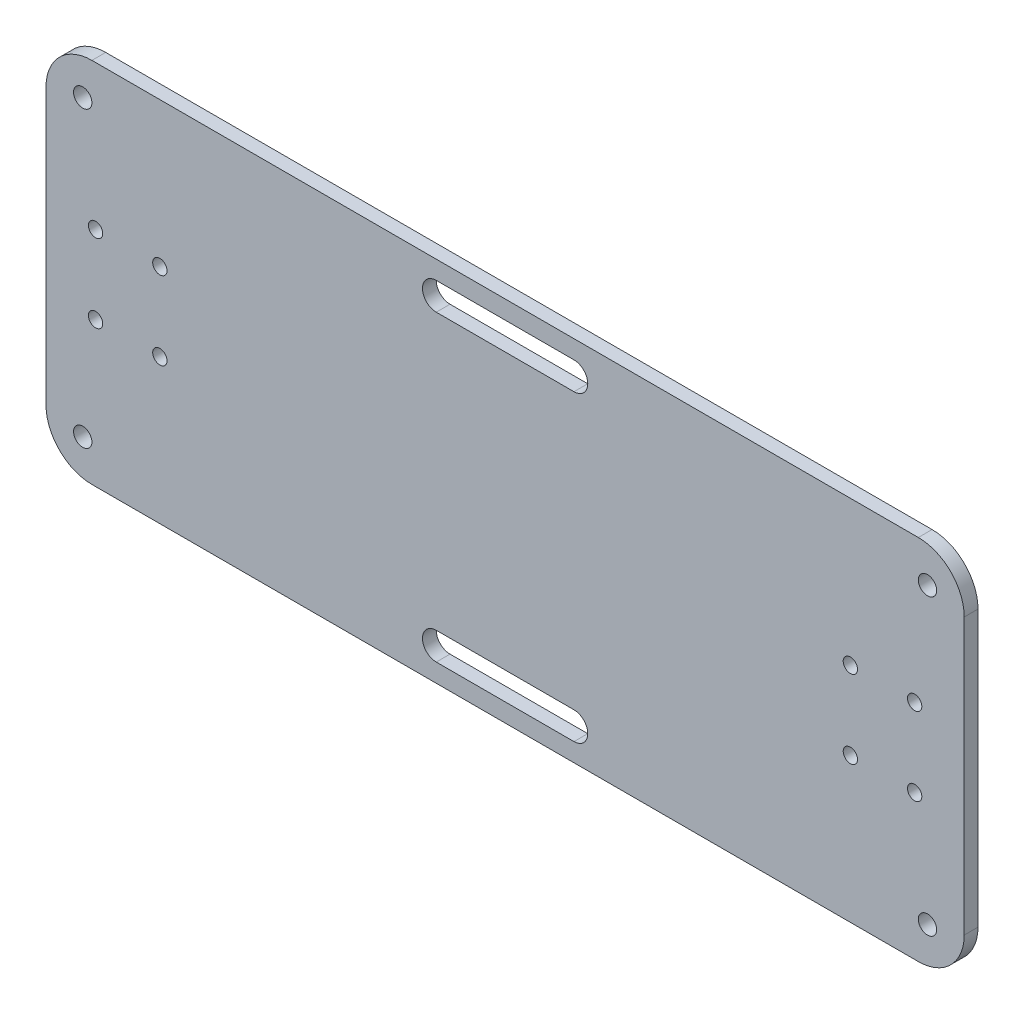
ISO-10303-21;
HEADER;
FILE_DESCRIPTION(('STEP AP214'),'2;1');
FILE_NAME('part.step','',(''),(''),'','','');
FILE_SCHEMA(('AUTOMOTIVE_DESIGN { 1 0 10303 214 1 1 1 1 }'));
ENDSEC;
DATA;
#1=APPLICATION_CONTEXT('core data for automotive mechanical design processes');
#2=APPLICATION_PROTOCOL_DEFINITION('international standard','automotive_design',2000,#1);
#3=PRODUCT_CONTEXT('',#1,'mechanical');
#4=PRODUCT('Part','Part','',(#3));
#5=PRODUCT_RELATED_PRODUCT_CATEGORY('part','',(#4));
#6=PRODUCT_DEFINITION_FORMATION('','',#4);
#7=PRODUCT_DEFINITION_CONTEXT('part definition',#1,'design');
#8=PRODUCT_DEFINITION('design','',#6,#7);
#9=PRODUCT_DEFINITION_SHAPE('','',#8);
#10=(LENGTH_UNIT() NAMED_UNIT(*) SI_UNIT(.MILLI.,.METRE.));
#11=(NAMED_UNIT(*) PLANE_ANGLE_UNIT() SI_UNIT($,.RADIAN.));
#12=(NAMED_UNIT(*) SI_UNIT($,.STERADIAN.) SOLID_ANGLE_UNIT());
#13=UNCERTAINTY_MEASURE_WITH_UNIT(LENGTH_MEASURE(1.E-05),#10,'distance_accuracy_value','');
#14=(GEOMETRIC_REPRESENTATION_CONTEXT(3) GLOBAL_UNCERTAINTY_ASSIGNED_CONTEXT((#13)) GLOBAL_UNIT_ASSIGNED_CONTEXT((#10,
#11,#12)) REPRESENTATION_CONTEXT('',''));
#15=CARTESIAN_POINT('',(0.,0.,0.));
#16=DIRECTION('',(0.,0.,1.));
#17=DIRECTION('',(1.,0.,0.));
#18=AXIS2_PLACEMENT_3D('',#15,#16,#17);
#19=CARTESIAN_POINT('',(100.,40.,3.));
#20=DIRECTION('',(-1.,0.,0.));
#21=DIRECTION('',(0.,0.,1.));
#22=AXIS2_PLACEMENT_3D('',#19,#20,#21);
#23=PLANE('',#22);
#24=DIRECTION('',(0.,1.,0.));
#25=VECTOR('',#24,1.);
#26=CARTESIAN_POINT('',(100.,40.,3.));
#27=LINE('',#26,#25);
#28=CARTESIAN_POINT('',(100.,-30.,3.));
#29=VERTEX_POINT('',#28);
#30=CARTESIAN_POINT('',(100.,30.,3.));
#31=VERTEX_POINT('',#30);
#32=EDGE_CURVE('E288',#29,#31,#27,.T.);
#33=ORIENTED_EDGE('',*,*,#32,.F.);
#34=DIRECTION('',(0.,0.,-1.));
#35=VECTOR('',#34,1.);
#36=CARTESIAN_POINT('',(100.,-30.,3.));
#37=LINE('',#36,#35);
#38=CARTESIAN_POINT('',(100.,-30.,0.));
#39=VERTEX_POINT('',#38);
#40=EDGE_CURVE('E339',#29,#39,#37,.T.);
#41=ORIENTED_EDGE('',*,*,#40,.T.);
#42=DIRECTION('',(0.,1.,0.));
#43=VECTOR('',#42,1.);
#44=CARTESIAN_POINT('',(100.,40.,0.));
#45=LINE('',#44,#43);
#46=CARTESIAN_POINT('',(100.,30.,0.));
#47=VERTEX_POINT('',#46);
#48=EDGE_CURVE('E285',#39,#47,#45,.T.);
#49=ORIENTED_EDGE('',*,*,#48,.T.);
#50=DIRECTION('',(0.,0.,-1.));
#51=VECTOR('',#50,1.);
#52=CARTESIAN_POINT('',(100.,30.,3.));
#53=LINE('',#52,#51);
#54=EDGE_CURVE('E337',#47,#31,#53,.F.);
#55=ORIENTED_EDGE('',*,*,#54,.T.);
#56=EDGE_LOOP('',(#33,#41,#49,#55));
#57=FACE_BOUND('',#56,.T.);
#58=ADVANCED_FACE('F33',(#57),#23,.F.);
#59=CARTESIAN_POINT('',(-100.,40.,3.));
#60=DIRECTION('',(0.,-1.,0.));
#61=DIRECTION('',(0.,0.,-1.));
#62=AXIS2_PLACEMENT_3D('',#59,#60,#61);
#63=PLANE('',#62);
#64=DIRECTION('',(-1.,0.,0.));
#65=VECTOR('',#64,1.);
#66=CARTESIAN_POINT('',(-100.,40.,3.));
#67=LINE('',#66,#65);
#68=CARTESIAN_POINT('',(90.,40.,3.));
#69=VERTEX_POINT('',#68);
#70=CARTESIAN_POINT('',(-90.,40.,3.));
#71=VERTEX_POINT('',#70);
#72=EDGE_CURVE('E291',#69,#71,#67,.T.);
#73=ORIENTED_EDGE('',*,*,#72,.F.);
#74=DIRECTION('',(0.,0.,-1.));
#75=VECTOR('',#74,1.);
#76=CARTESIAN_POINT('',(90.,40.,3.));
#77=LINE('',#76,#75);
#78=CARTESIAN_POINT('',(90.,40.,0.));
#79=VERTEX_POINT('',#78);
#80=EDGE_CURVE('E11',#69,#79,#77,.T.);
#81=ORIENTED_EDGE('',*,*,#80,.T.);
#82=DIRECTION('',(-1.,0.,0.));
#83=VECTOR('',#82,1.);
#84=CARTESIAN_POINT('',(-100.,40.,0.));
#85=LINE('',#84,#83);
#86=CARTESIAN_POINT('',(-90.,40.,0.));
#87=VERTEX_POINT('',#86);
#88=EDGE_CURVE('E304',#79,#87,#85,.T.);
#89=ORIENTED_EDGE('',*,*,#88,.T.);
#90=DIRECTION('',(0.,0.,-1.));
#91=VECTOR('',#90,1.);
#92=CARTESIAN_POINT('',(-90.,40.,3.));
#93=LINE('',#92,#91);
#94=EDGE_CURVE('E41',#87,#71,#93,.F.);
#95=ORIENTED_EDGE('',*,*,#94,.T.);
#96=EDGE_LOOP('',(#73,#81,#89,#95));
#97=FACE_BOUND('',#96,.T.);
#98=ADVANCED_FACE('F344',(#97),#63,.F.);
#99=CARTESIAN_POINT('',(-100.,40.,3.));
#100=DIRECTION('',(1.,0.,0.));
#101=DIRECTION('',(0.,0.,-1.));
#102=AXIS2_PLACEMENT_3D('',#99,#100,#101);
#103=PLANE('',#102);
#104=DIRECTION('',(0.,-1.,0.));
#105=VECTOR('',#104,1.);
#106=CARTESIAN_POINT('',(-100.,40.,0.));
#107=LINE('',#106,#105);
#108=CARTESIAN_POINT('',(-100.,30.,0.));
#109=VERTEX_POINT('',#108);
#110=CARTESIAN_POINT('',(-100.,-30.,0.));
#111=VERTEX_POINT('',#110);
#112=EDGE_CURVE('E307',#109,#111,#107,.T.);
#113=ORIENTED_EDGE('',*,*,#112,.T.);
#114=DIRECTION('',(0.,0.,-1.));
#115=VECTOR('',#114,1.);
#116=CARTESIAN_POINT('',(-100.,-30.,3.));
#117=LINE('',#116,#115);
#118=CARTESIAN_POINT('',(-100.,-30.,3.));
#119=VERTEX_POINT('',#118);
#120=EDGE_CURVE('E327',#111,#119,#117,.F.);
#121=ORIENTED_EDGE('',*,*,#120,.T.);
#122=DIRECTION('',(0.,-1.,0.));
#123=VECTOR('',#122,1.);
#124=CARTESIAN_POINT('',(-100.,40.,3.));
#125=LINE('',#124,#123);
#126=CARTESIAN_POINT('',(-100.,30.,3.));
#127=VERTEX_POINT('',#126);
#128=EDGE_CURVE('E295',#127,#119,#125,.T.);
#129=ORIENTED_EDGE('',*,*,#128,.F.);
#130=DIRECTION('',(0.,0.,-1.));
#131=VECTOR('',#130,1.);
#132=CARTESIAN_POINT('',(-100.,30.,3.));
#133=LINE('',#132,#131);
#134=EDGE_CURVE('E324',#127,#109,#133,.T.);
#135=ORIENTED_EDGE('',*,*,#134,.T.);
#136=EDGE_LOOP('',(#113,#121,#129,#135));
#137=FACE_BOUND('',#136,.T.);
#138=ADVANCED_FACE('F356',(#137),#103,.F.);
#139=CARTESIAN_POINT('',(-100.,-40.,3.));
#140=DIRECTION('',(0.,1.,0.));
#141=DIRECTION('',(0.,0.,1.));
#142=AXIS2_PLACEMENT_3D('',#139,#140,#141);
#143=PLANE('',#142);
#144=DIRECTION('',(1.,0.,0.));
#145=VECTOR('',#144,1.);
#146=CARTESIAN_POINT('',(-100.,-40.,3.));
#147=LINE('',#146,#145);
#148=CARTESIAN_POINT('',(-90.,-40.,3.));
#149=VERTEX_POINT('',#148);
#150=CARTESIAN_POINT('',(90.,-40.,3.));
#151=VERTEX_POINT('',#150);
#152=EDGE_CURVE('E298',#149,#151,#147,.T.);
#153=ORIENTED_EDGE('',*,*,#152,.F.);
#154=DIRECTION('',(0.,0.,-1.));
#155=VECTOR('',#154,1.);
#156=CARTESIAN_POINT('',(-90.,-40.,3.));
#157=LINE('',#156,#155);
#158=CARTESIAN_POINT('',(-90.,-40.,0.));
#159=VERTEX_POINT('',#158);
#160=EDGE_CURVE('E313',#149,#159,#157,.T.);
#161=ORIENTED_EDGE('',*,*,#160,.T.);
#162=DIRECTION('',(1.,0.,0.));
#163=VECTOR('',#162,1.);
#164=CARTESIAN_POINT('',(-100.,-40.,0.));
#165=LINE('',#164,#163);
#166=CARTESIAN_POINT('',(90.,-40.,0.));
#167=VERTEX_POINT('',#166);
#168=EDGE_CURVE('E292',#159,#167,#165,.T.);
#169=ORIENTED_EDGE('',*,*,#168,.T.);
#170=DIRECTION('',(0.,0.,-1.));
#171=VECTOR('',#170,1.);
#172=CARTESIAN_POINT('',(90.,-40.,3.));
#173=LINE('',#172,#171);
#174=EDGE_CURVE('E301',#167,#151,#173,.F.);
#175=ORIENTED_EDGE('',*,*,#174,.T.);
#176=EDGE_LOOP('',(#153,#161,#169,#175));
#177=FACE_BOUND('',#176,.T.);
#178=ADVANCED_FACE('F366',(#177),#143,.F.);
#179=CARTESIAN_POINT('',(0.,0.,3.));
#180=DIRECTION('',(0.,0.,1.));
#181=DIRECTION('',(1.,0.,0.));
#182=AXIS2_PLACEMENT_3D('',#179,#180,#181);
#183=PLANE('',#182);
#184=CARTESIAN_POINT('',(15.,33.,3.));
#185=DIRECTION('',(0.,0.,1.));
#186=DIRECTION('',(1.,0.,0.));
#187=AXIS2_PLACEMENT_3D('',#184,#185,#186);
#188=CIRCLE('',#187,3.);
#189=CARTESIAN_POINT('',(15.,30.,3.));
#190=VERTEX_POINT('',#189);
#191=CARTESIAN_POINT('',(15.,36.,3.));
#192=VERTEX_POINT('',#191);
#193=EDGE_CURVE('E48',#190,#192,#188,.T.);
#194=ORIENTED_EDGE('',*,*,#193,.F.);
#195=DIRECTION('',(1.,0.,0.));
#196=VECTOR('',#195,1.);
#197=CARTESIAN_POINT('',(15.,30.,3.));
#198=LINE('',#197,#196);
#199=CARTESIAN_POINT('',(-15.,30.,3.));
#200=VERTEX_POINT('',#199);
#201=EDGE_CURVE('E167',#200,#190,#198,.T.);
#202=ORIENTED_EDGE('',*,*,#201,.F.);
#203=CARTESIAN_POINT('',(-15.,33.,3.));
#204=DIRECTION('',(0.,0.,1.));
#205=DIRECTION('',(1.,0.,0.));
#206=AXIS2_PLACEMENT_3D('',#203,#204,#205);
#207=CIRCLE('',#206,3.);
#208=CARTESIAN_POINT('',(-15.,36.,3.));
#209=VERTEX_POINT('',#208);
#210=EDGE_CURVE('E170',#209,#200,#207,.T.);
#211=ORIENTED_EDGE('',*,*,#210,.F.);
#212=DIRECTION('',(-1.,0.,0.));
#213=VECTOR('',#212,1.);
#214=CARTESIAN_POINT('',(15.,36.,3.));
#215=LINE('',#214,#213);
#216=EDGE_CURVE('E176',#192,#209,#215,.T.);
#217=ORIENTED_EDGE('',*,*,#216,.F.);
#218=EDGE_LOOP('',(#194,#202,#211,#217));
#219=FACE_BOUND('',#218,.T.);
#220=CARTESIAN_POINT('',(15.,-33.,3.));
#221=DIRECTION('',(0.,0.,1.));
#222=DIRECTION('',(-1.,0.,0.));
#223=AXIS2_PLACEMENT_3D('',#220,#221,#222);
#224=CIRCLE('',#223,3.);
#225=CARTESIAN_POINT('',(15.,-36.,3.));
#226=VERTEX_POINT('',#225);
#227=CARTESIAN_POINT('',(15.,-30.,3.));
#228=VERTEX_POINT('',#227);
#229=EDGE_CURVE('E56',#226,#228,#224,.T.);
#230=ORIENTED_EDGE('',*,*,#229,.F.);
#231=DIRECTION('',(1.,0.,0.));
#232=VECTOR('',#231,1.);
#233=CARTESIAN_POINT('',(15.,-36.,3.));
#234=LINE('',#233,#232);
#235=CARTESIAN_POINT('',(-15.,-36.,3.));
#236=VERTEX_POINT('',#235);
#237=EDGE_CURVE('E191',#236,#226,#234,.T.);
#238=ORIENTED_EDGE('',*,*,#237,.F.);
#239=CARTESIAN_POINT('',(-15.,-33.,3.));
#240=DIRECTION('',(0.,0.,1.));
#241=DIRECTION('',(-1.,0.,0.));
#242=AXIS2_PLACEMENT_3D('',#239,#240,#241);
#243=CIRCLE('',#242,3.);
#244=CARTESIAN_POINT('',(-15.,-30.,3.));
#245=VERTEX_POINT('',#244);
#246=EDGE_CURVE('E205',#245,#236,#243,.T.);
#247=ORIENTED_EDGE('',*,*,#246,.F.);
#248=DIRECTION('',(-1.,0.,0.));
#249=VECTOR('',#248,1.);
#250=CARTESIAN_POINT('',(15.,-30.,3.));
#251=LINE('',#250,#249);
#252=EDGE_CURVE('E202',#228,#245,#251,.T.);
#253=ORIENTED_EDGE('',*,*,#252,.F.);
#254=EDGE_LOOP('',(#230,#238,#247,#253));
#255=FACE_BOUND('',#254,.T.);
#256=CARTESIAN_POINT('',(89.2,-8.5,3.));
#257=DIRECTION('',(0.,0.,-1.));
#258=DIRECTION('',(-1.,0.,0.));
#259=AXIS2_PLACEMENT_3D('',#256,#257,#258);
#260=CIRCLE('',#259,1.560556942875);
#261=CARTESIAN_POINT('',(87.639443057125,-8.5,3.));
#262=VERTEX_POINT('',#261);
#263=EDGE_CURVE('E241',#262,#262,#260,.T.);
#264=ORIENTED_EDGE('',*,*,#263,.T.);
#265=EDGE_LOOP('',(#264));
#266=FACE_BOUND('',#265,.T.);
#267=CARTESIAN_POINT('',(-89.2,8.5,3.));
#268=DIRECTION('',(0.,0.,-1.));
#269=DIRECTION('',(-1.,0.,0.));
#270=AXIS2_PLACEMENT_3D('',#267,#268,#269);
#271=CIRCLE('',#270,1.560556942875);
#272=CARTESIAN_POINT('',(-90.760556942875,8.5,3.));
#273=VERTEX_POINT('',#272);
#274=EDGE_CURVE('E234',#273,#273,#271,.T.);
#275=ORIENTED_EDGE('',*,*,#274,.T.);
#276=EDGE_LOOP('',(#275));
#277=FACE_BOUND('',#276,.T.);
#278=CARTESIAN_POINT('',(-75.2,8.5,3.));
#279=DIRECTION('',(0.,0.,-1.));
#280=DIRECTION('',(-1.,0.,0.));
#281=AXIS2_PLACEMENT_3D('',#278,#279,#280);
#282=CIRCLE('',#281,1.560556942875);
#283=CARTESIAN_POINT('',(-76.760556942875,8.5,3.));
#284=VERTEX_POINT('',#283);
#285=EDGE_CURVE('E253',#284,#284,#282,.T.);
#286=ORIENTED_EDGE('',*,*,#285,.T.);
#287=EDGE_LOOP('',(#286));
#288=FACE_BOUND('',#287,.T.);
#289=CARTESIAN_POINT('',(-75.2,-8.5,3.));
#290=DIRECTION('',(0.,0.,-1.));
#291=DIRECTION('',(-1.,0.,0.));
#292=AXIS2_PLACEMENT_3D('',#289,#290,#291);
#293=CIRCLE('',#292,1.560556942875);
#294=CARTESIAN_POINT('',(-76.760556942875,-8.5,3.));
#295=VERTEX_POINT('',#294);
#296=EDGE_CURVE('E246',#295,#295,#293,.T.);
#297=ORIENTED_EDGE('',*,*,#296,.T.);
#298=EDGE_LOOP('',(#297));
#299=FACE_BOUND('',#298,.T.);
#300=CARTESIAN_POINT('',(75.2,8.5,3.));
#301=DIRECTION('',(0.,0.,-1.));
#302=DIRECTION('',(-1.,0.,0.));
#303=AXIS2_PLACEMENT_3D('',#300,#301,#302);
#304=CIRCLE('',#303,1.560556942875);
#305=CARTESIAN_POINT('',(73.639443057125,8.5,3.));
#306=VERTEX_POINT('',#305);
#307=EDGE_CURVE('E216',#306,#306,#304,.T.);
#308=ORIENTED_EDGE('',*,*,#307,.T.);
#309=EDGE_LOOP('',(#308));
#310=FACE_BOUND('',#309,.T.);
#311=CARTESIAN_POINT('',(89.2,8.5,3.));
#312=DIRECTION('',(0.,0.,-1.));
#313=DIRECTION('',(-1.,0.,0.));
#314=AXIS2_PLACEMENT_3D('',#311,#312,#313);
#315=CIRCLE('',#314,1.560556942875);
#316=CARTESIAN_POINT('',(87.639443057125,8.5,3.));
#317=VERTEX_POINT('',#316);
#318=EDGE_CURVE('E229',#317,#317,#315,.T.);
#319=ORIENTED_EDGE('',*,*,#318,.T.);
#320=EDGE_LOOP('',(#319));
#321=FACE_BOUND('',#320,.T.);
#322=CARTESIAN_POINT('',(75.2,-8.5,3.));
#323=DIRECTION('',(0.,0.,-1.));
#324=DIRECTION('',(-1.,0.,0.));
#325=AXIS2_PLACEMENT_3D('',#322,#323,#324);
#326=CIRCLE('',#325,1.560556942875);
#327=CARTESIAN_POINT('',(73.639443057125,-8.5,3.));
#328=VERTEX_POINT('',#327);
#329=EDGE_CURVE('E222',#328,#328,#326,.T.);
#330=ORIENTED_EDGE('',*,*,#329,.T.);
#331=EDGE_LOOP('',(#330));
#332=FACE_BOUND('',#331,.T.);
#333=CARTESIAN_POINT('',(-89.2,-8.5,3.));
#334=DIRECTION('',(0.,0.,-1.));
#335=DIRECTION('',(-1.,0.,0.));
#336=AXIS2_PLACEMENT_3D('',#333,#334,#335);
#337=CIRCLE('',#336,1.560556942875);
#338=CARTESIAN_POINT('',(-90.760556942875,-8.5,3.));
#339=VERTEX_POINT('',#338);
#340=EDGE_CURVE('E258',#339,#339,#337,.T.);
#341=ORIENTED_EDGE('',*,*,#340,.T.);
#342=EDGE_LOOP('',(#341));
#343=FACE_BOUND('',#342,.T.);
#344=CARTESIAN_POINT('',(92.,32.,3.));
#345=DIRECTION('',(0.,0.,1.));
#346=DIRECTION('',(-1.,0.,0.));
#347=AXIS2_PLACEMENT_3D('',#344,#345,#346);
#348=CIRCLE('',#347,2.);
#349=CARTESIAN_POINT('',(90.,32.,3.));
#350=VERTEX_POINT('',#349);
#351=EDGE_CURVE('E261',#350,#350,#348,.T.);
#352=ORIENTED_EDGE('',*,*,#351,.F.);
#353=EDGE_LOOP('',(#352));
#354=FACE_BOUND('',#353,.T.);
#355=CARTESIAN_POINT('',(92.0000000000001,-32.,3.));
#356=DIRECTION('',(0.,0.,1.));
#357=DIRECTION('',(1.,0.,0.));
#358=AXIS2_PLACEMENT_3D('',#355,#356,#357);
#359=CIRCLE('',#358,2.);
#360=CARTESIAN_POINT('',(94.0000000000001,-32.,3.));
#361=VERTEX_POINT('',#360);
#362=EDGE_CURVE('E274',#361,#361,#359,.T.);
#363=ORIENTED_EDGE('',*,*,#362,.F.);
#364=EDGE_LOOP('',(#363));
#365=FACE_BOUND('',#364,.T.);
#366=CARTESIAN_POINT('',(-92.,-32.,3.));
#367=DIRECTION('',(0.,0.,1.));
#368=DIRECTION('',(-1.,0.,0.));
#369=AXIS2_PLACEMENT_3D('',#366,#367,#368);
#370=CIRCLE('',#369,2.);
#371=CARTESIAN_POINT('',(-94.,-32.,3.));
#372=VERTEX_POINT('',#371);
#373=EDGE_CURVE('E268',#372,#372,#370,.T.);
#374=ORIENTED_EDGE('',*,*,#373,.F.);
#375=EDGE_LOOP('',(#374));
#376=FACE_BOUND('',#375,.T.);
#377=CARTESIAN_POINT('',(-92.,32.,3.));
#378=DIRECTION('',(0.,0.,1.));
#379=DIRECTION('',(1.,0.,0.));
#380=AXIS2_PLACEMENT_3D('',#377,#378,#379);
#381=CIRCLE('',#380,2.);
#382=CARTESIAN_POINT('',(-90.,32.,3.));
#383=VERTEX_POINT('',#382);
#384=EDGE_CURVE('E267',#383,#383,#381,.T.);
#385=ORIENTED_EDGE('',*,*,#384,.F.);
#386=EDGE_LOOP('',(#385));
#387=FACE_BOUND('',#386,.T.);
#388=ORIENTED_EDGE('',*,*,#128,.T.);
#389=CARTESIAN_POINT('',(-90.,-30.,3.));
#390=DIRECTION('',(0.,0.,1.));
#391=DIRECTION('',(1.,0.,0.));
#392=AXIS2_PLACEMENT_3D('',#389,#390,#391);
#393=CIRCLE('',#392,10.);
#394=EDGE_CURVE('E335',#119,#149,#393,.T.);
#395=ORIENTED_EDGE('',*,*,#394,.T.);
#396=ORIENTED_EDGE('',*,*,#152,.T.);
#397=CARTESIAN_POINT('',(90.,-30.,3.));
#398=DIRECTION('',(0.,0.,1.));
#399=DIRECTION('',(1.,0.,0.));
#400=AXIS2_PLACEMENT_3D('',#397,#398,#399);
#401=CIRCLE('',#400,10.);
#402=EDGE_CURVE('E333',#151,#29,#401,.T.);
#403=ORIENTED_EDGE('',*,*,#402,.T.);
#404=ORIENTED_EDGE('',*,*,#32,.T.);
#405=CARTESIAN_POINT('',(90.,30.,3.));
#406=DIRECTION('',(0.,0.,1.));
#407=DIRECTION('',(1.,0.,0.));
#408=AXIS2_PLACEMENT_3D('',#405,#406,#407);
#409=CIRCLE('',#408,10.);
#410=EDGE_CURVE('E331',#31,#69,#409,.T.);
#411=ORIENTED_EDGE('',*,*,#410,.T.);
#412=ORIENTED_EDGE('',*,*,#72,.T.);
#413=CARTESIAN_POINT('',(-90.,30.,3.));
#414=DIRECTION('',(0.,0.,1.));
#415=DIRECTION('',(1.,0.,0.));
#416=AXIS2_PLACEMENT_3D('',#413,#414,#415);
#417=CIRCLE('',#416,10.);
#418=EDGE_CURVE('E329',#71,#127,#417,.T.);
#419=ORIENTED_EDGE('',*,*,#418,.T.);
#420=EDGE_LOOP('',(#388,#395,#396,#403,#404,#411,#412,#419));
#421=FACE_BOUND('',#420,.T.);
#422=ADVANCED_FACE('F350',(#219,#255,#266,#277,#288,#299,#310,#321,#332,#343,#354,#365,#376,
#387,#421),#183,.T.);
#423=CARTESIAN_POINT('',(0.,0.,0.));
#424=DIRECTION('',(0.,0.,1.));
#425=DIRECTION('',(1.,0.,0.));
#426=AXIS2_PLACEMENT_3D('',#423,#424,#425);
#427=PLANE('',#426);
#428=DIRECTION('',(1.,0.,0.));
#429=VECTOR('',#428,1.);
#430=CARTESIAN_POINT('',(15.,30.,0.));
#431=LINE('',#430,#429);
#432=CARTESIAN_POINT('',(-15.,30.,0.));
#433=VERTEX_POINT('',#432);
#434=CARTESIAN_POINT('',(15.,30.,0.));
#435=VERTEX_POINT('',#434);
#436=EDGE_CURVE('E154',#433,#435,#431,.T.);
#437=ORIENTED_EDGE('',*,*,#436,.T.);
#438=CARTESIAN_POINT('',(15.,33.,0.));
#439=DIRECTION('',(0.,0.,1.));
#440=DIRECTION('',(1.,0.,0.));
#441=AXIS2_PLACEMENT_3D('',#438,#439,#440);
#442=CIRCLE('',#441,3.);
#443=CARTESIAN_POINT('',(15.,36.,0.));
#444=VERTEX_POINT('',#443);
#445=EDGE_CURVE('E148',#435,#444,#442,.T.);
#446=ORIENTED_EDGE('',*,*,#445,.T.);
#447=DIRECTION('',(-1.,0.,0.));
#448=VECTOR('',#447,1.);
#449=CARTESIAN_POINT('',(15.,36.,0.));
#450=LINE('',#449,#448);
#451=CARTESIAN_POINT('',(-15.,36.,0.));
#452=VERTEX_POINT('',#451);
#453=EDGE_CURVE('E158',#444,#452,#450,.T.);
#454=ORIENTED_EDGE('',*,*,#453,.T.);
#455=CARTESIAN_POINT('',(-15.,33.,0.));
#456=DIRECTION('',(0.,0.,1.));
#457=DIRECTION('',(1.,0.,0.));
#458=AXIS2_PLACEMENT_3D('',#455,#456,#457);
#459=CIRCLE('',#458,3.);
#460=EDGE_CURVE('E162',#452,#433,#459,.T.);
#461=ORIENTED_EDGE('',*,*,#460,.T.);
#462=EDGE_LOOP('',(#437,#446,#454,#461));
#463=FACE_BOUND('',#462,.T.);
#464=DIRECTION('',(1.,0.,0.));
#465=VECTOR('',#464,1.);
#466=CARTESIAN_POINT('',(15.,-36.,0.));
#467=LINE('',#466,#465);
#468=CARTESIAN_POINT('',(-15.,-36.,0.));
#469=VERTEX_POINT('',#468);
#470=CARTESIAN_POINT('',(15.,-36.,0.));
#471=VERTEX_POINT('',#470);
#472=EDGE_CURVE('E197',#469,#471,#467,.T.);
#473=ORIENTED_EDGE('',*,*,#472,.T.);
#474=CARTESIAN_POINT('',(15.,-33.,0.));
#475=DIRECTION('',(0.,0.,1.));
#476=DIRECTION('',(-1.,0.,0.));
#477=AXIS2_PLACEMENT_3D('',#474,#475,#476);
#478=CIRCLE('',#477,3.);
#479=CARTESIAN_POINT('',(15.,-30.,0.));
#480=VERTEX_POINT('',#479);
#481=EDGE_CURVE('E187',#471,#480,#478,.T.);
#482=ORIENTED_EDGE('',*,*,#481,.T.);
#483=DIRECTION('',(-1.,0.,0.));
#484=VECTOR('',#483,1.);
#485=CARTESIAN_POINT('',(15.,-30.,0.));
#486=LINE('',#485,#484);
#487=CARTESIAN_POINT('',(-15.,-30.,0.));
#488=VERTEX_POINT('',#487);
#489=EDGE_CURVE('E190',#480,#488,#486,.T.);
#490=ORIENTED_EDGE('',*,*,#489,.T.);
#491=CARTESIAN_POINT('',(-15.,-33.,0.));
#492=DIRECTION('',(0.,0.,1.));
#493=DIRECTION('',(-1.,0.,0.));
#494=AXIS2_PLACEMENT_3D('',#491,#492,#493);
#495=CIRCLE('',#494,3.);
#496=EDGE_CURVE('E194',#488,#469,#495,.T.);
#497=ORIENTED_EDGE('',*,*,#496,.T.);
#498=EDGE_LOOP('',(#473,#482,#490,#497));
#499=FACE_BOUND('',#498,.T.);
#500=CARTESIAN_POINT('',(89.2,-8.5,0.));
#501=DIRECTION('',(0.,0.,-1.));
#502=DIRECTION('',(-1.,0.,0.));
#503=AXIS2_PLACEMENT_3D('',#500,#501,#502);
#504=CIRCLE('',#503,1.560556942875);
#505=CARTESIAN_POINT('',(87.639443057125,-8.5,0.));
#506=VERTEX_POINT('',#505);
#507=EDGE_CURVE('E225',#506,#506,#504,.T.);
#508=ORIENTED_EDGE('',*,*,#507,.F.);
#509=EDGE_LOOP('',(#508));
#510=FACE_BOUND('',#509,.T.);
#511=CARTESIAN_POINT('',(-89.2,8.5,0.));
#512=DIRECTION('',(0.,0.,-1.));
#513=DIRECTION('',(-1.,0.,0.));
#514=AXIS2_PLACEMENT_3D('',#511,#512,#513);
#515=CIRCLE('',#514,1.560556942875);
#516=CARTESIAN_POINT('',(-90.760556942875,8.5,0.));
#517=VERTEX_POINT('',#516);
#518=EDGE_CURVE('E238',#517,#517,#515,.T.);
#519=ORIENTED_EDGE('',*,*,#518,.F.);
#520=EDGE_LOOP('',(#519));
#521=FACE_BOUND('',#520,.T.);
#522=CARTESIAN_POINT('',(-75.2,8.5,0.));
#523=DIRECTION('',(0.,0.,-1.));
#524=DIRECTION('',(-1.,0.,0.));
#525=AXIS2_PLACEMENT_3D('',#522,#523,#524);
#526=CIRCLE('',#525,1.560556942875);
#527=CARTESIAN_POINT('',(-76.760556942875,8.5,0.));
#528=VERTEX_POINT('',#527);
#529=EDGE_CURVE('E237',#528,#528,#526,.T.);
#530=ORIENTED_EDGE('',*,*,#529,.F.);
#531=EDGE_LOOP('',(#530));
#532=FACE_BOUND('',#531,.T.);
#533=CARTESIAN_POINT('',(-75.2,-8.5,0.));
#534=DIRECTION('',(0.,0.,-1.));
#535=DIRECTION('',(-1.,0.,0.));
#536=AXIS2_PLACEMENT_3D('',#533,#534,#535);
#537=CIRCLE('',#536,1.560556942875);
#538=CARTESIAN_POINT('',(-76.760556942875,-8.5,0.));
#539=VERTEX_POINT('',#538);
#540=EDGE_CURVE('E250',#539,#539,#537,.T.);
#541=ORIENTED_EDGE('',*,*,#540,.F.);
#542=EDGE_LOOP('',(#541));
#543=FACE_BOUND('',#542,.T.);
#544=CARTESIAN_POINT('',(75.2,8.5,0.));
#545=DIRECTION('',(0.,0.,-1.));
#546=DIRECTION('',(-1.,0.,0.));
#547=AXIS2_PLACEMENT_3D('',#544,#545,#546);
#548=CIRCLE('',#547,1.560556942875);
#549=CARTESIAN_POINT('',(73.639443057125,8.5,0.));
#550=VERTEX_POINT('',#549);
#551=EDGE_CURVE('E183',#550,#550,#548,.T.);
#552=ORIENTED_EDGE('',*,*,#551,.F.);
#553=EDGE_LOOP('',(#552));
#554=FACE_BOUND('',#553,.T.);
#555=CARTESIAN_POINT('',(89.2,8.5,0.));
#556=DIRECTION('',(0.,0.,-1.));
#557=DIRECTION('',(-1.,0.,0.));
#558=AXIS2_PLACEMENT_3D('',#555,#556,#557);
#559=CIRCLE('',#558,1.560556942875);
#560=CARTESIAN_POINT('',(87.639443057125,8.5,0.));
#561=VERTEX_POINT('',#560);
#562=EDGE_CURVE('E219',#561,#561,#559,.T.);
#563=ORIENTED_EDGE('',*,*,#562,.F.);
#564=EDGE_LOOP('',(#563));
#565=FACE_BOUND('',#564,.T.);
#566=CARTESIAN_POINT('',(75.2,-8.5,0.));
#567=DIRECTION('',(0.,0.,-1.));
#568=DIRECTION('',(-1.,0.,0.));
#569=AXIS2_PLACEMENT_3D('',#566,#567,#568);
#570=CIRCLE('',#569,1.560556942875);
#571=CARTESIAN_POINT('',(73.639443057125,-8.5,0.));
#572=VERTEX_POINT('',#571);
#573=EDGE_CURVE('E226',#572,#572,#570,.T.);
#574=ORIENTED_EDGE('',*,*,#573,.F.);
#575=EDGE_LOOP('',(#574));
#576=FACE_BOUND('',#575,.T.);
#577=CARTESIAN_POINT('',(-89.2,-8.5,0.));
#578=DIRECTION('',(0.,0.,-1.));
#579=DIRECTION('',(-1.,0.,0.));
#580=AXIS2_PLACEMENT_3D('',#577,#578,#579);
#581=CIRCLE('',#580,1.560556942875);
#582=CARTESIAN_POINT('',(-90.760556942875,-8.5,0.));
#583=VERTEX_POINT('',#582);
#584=EDGE_CURVE('E249',#583,#583,#581,.T.);
#585=ORIENTED_EDGE('',*,*,#584,.F.);
#586=EDGE_LOOP('',(#585));
#587=FACE_BOUND('',#586,.T.);
#588=CARTESIAN_POINT('',(92.,32.,0.));
#589=DIRECTION('',(0.,0.,1.));
#590=DIRECTION('',(-1.,0.,0.));
#591=AXIS2_PLACEMENT_3D('',#588,#589,#590);
#592=CIRCLE('',#591,2.);
#593=CARTESIAN_POINT('',(90.,32.,0.));
#594=VERTEX_POINT('',#593);
#595=EDGE_CURVE('E277',#594,#594,#592,.T.);
#596=ORIENTED_EDGE('',*,*,#595,.T.);
#597=EDGE_LOOP('',(#596));
#598=FACE_BOUND('',#597,.T.);
#599=CARTESIAN_POINT('',(92.0000000000001,-32.,0.));
#600=DIRECTION('',(0.,0.,1.));
#601=DIRECTION('',(1.,0.,0.));
#602=AXIS2_PLACEMENT_3D('',#599,#600,#601);
#603=CIRCLE('',#602,2.);
#604=CARTESIAN_POINT('',(94.0000000000001,-32.,0.));
#605=VERTEX_POINT('',#604);
#606=EDGE_CURVE('E271',#605,#605,#603,.T.);
#607=ORIENTED_EDGE('',*,*,#606,.T.);
#608=EDGE_LOOP('',(#607));
#609=FACE_BOUND('',#608,.T.);
#610=CARTESIAN_POINT('',(-92.,-32.,0.));
#611=DIRECTION('',(0.,0.,1.));
#612=DIRECTION('',(-1.,0.,0.));
#613=AXIS2_PLACEMENT_3D('',#610,#611,#612);
#614=CIRCLE('',#613,2.);
#615=CARTESIAN_POINT('',(-94.,-32.,0.));
#616=VERTEX_POINT('',#615);
#617=EDGE_CURVE('E264',#616,#616,#614,.T.);
#618=ORIENTED_EDGE('',*,*,#617,.T.);
#619=EDGE_LOOP('',(#618));
#620=FACE_BOUND('',#619,.T.);
#621=CARTESIAN_POINT('',(-92.,32.,0.));
#622=DIRECTION('',(0.,0.,1.));
#623=DIRECTION('',(1.,0.,0.));
#624=AXIS2_PLACEMENT_3D('',#621,#622,#623);
#625=CIRCLE('',#624,2.);
#626=CARTESIAN_POINT('',(-90.,32.,0.));
#627=VERTEX_POINT('',#626);
#628=EDGE_CURVE('E282',#627,#627,#625,.T.);
#629=ORIENTED_EDGE('',*,*,#628,.T.);
#630=EDGE_LOOP('',(#629));
#631=FACE_BOUND('',#630,.T.);
#632=ORIENTED_EDGE('',*,*,#168,.F.);
#633=CARTESIAN_POINT('',(-90.,-30.,0.));
#634=DIRECTION('',(0.,0.,1.));
#635=DIRECTION('',(1.,0.,0.));
#636=AXIS2_PLACEMENT_3D('',#633,#634,#635);
#637=CIRCLE('',#636,10.);
#638=EDGE_CURVE('E322',#159,#111,#637,.F.);
#639=ORIENTED_EDGE('',*,*,#638,.T.);
#640=ORIENTED_EDGE('',*,*,#112,.F.);
#641=CARTESIAN_POINT('',(-90.,30.,0.));
#642=DIRECTION('',(0.,0.,1.));
#643=DIRECTION('',(1.,0.,0.));
#644=AXIS2_PLACEMENT_3D('',#641,#642,#643);
#645=CIRCLE('',#644,10.);
#646=EDGE_CURVE('E316',#109,#87,#645,.F.);
#647=ORIENTED_EDGE('',*,*,#646,.T.);
#648=ORIENTED_EDGE('',*,*,#88,.F.);
#649=CARTESIAN_POINT('',(90.,30.,0.));
#650=DIRECTION('',(0.,0.,1.));
#651=DIRECTION('',(1.,0.,0.));
#652=AXIS2_PLACEMENT_3D('',#649,#650,#651);
#653=CIRCLE('',#652,10.);
#654=EDGE_CURVE('E318',#79,#47,#653,.F.);
#655=ORIENTED_EDGE('',*,*,#654,.T.);
#656=ORIENTED_EDGE('',*,*,#48,.F.);
#657=CARTESIAN_POINT('',(90.,-30.,0.));
#658=DIRECTION('',(0.,0.,1.));
#659=DIRECTION('',(1.,0.,0.));
#660=AXIS2_PLACEMENT_3D('',#657,#658,#659);
#661=CIRCLE('',#660,10.);
#662=EDGE_CURVE('E320',#39,#167,#661,.F.);
#663=ORIENTED_EDGE('',*,*,#662,.T.);
#664=EDGE_LOOP('',(#632,#639,#640,#647,#648,#655,#656,#663));
#665=FACE_BOUND('',#664,.T.);
#666=ADVANCED_FACE('F164',(#463,#499,#510,#521,#532,#543,#554,#565,#576,#587,#598,#609,#620,
#631,#665),#427,.F.);
#667=CARTESIAN_POINT('',(-92.,32.,0.));
#668=DIRECTION('',(0.,0.,1.));
#669=DIRECTION('',(1.,0.,0.));
#670=AXIS2_PLACEMENT_3D('',#667,#668,#669);
#671=CYLINDRICAL_SURFACE('',#670,2.);
#672=ORIENTED_EDGE('',*,*,#628,.F.);
#673=EDGE_LOOP('',(#672));
#674=FACE_BOUND('',#673,.T.);
#675=ORIENTED_EDGE('',*,*,#384,.T.);
#676=EDGE_LOOP('',(#675));
#677=FACE_BOUND('',#676,.T.);
#678=ADVANCED_FACE('F411',(#674,#677),#671,.F.);
#679=CARTESIAN_POINT('',(-92.,-32.,0.));
#680=DIRECTION('',(0.,0.,1.));
#681=DIRECTION('',(1.,0.,0.));
#682=AXIS2_PLACEMENT_3D('',#679,#680,#681);
#683=CYLINDRICAL_SURFACE('',#682,2.);
#684=ORIENTED_EDGE('',*,*,#617,.F.);
#685=EDGE_LOOP('',(#684));
#686=FACE_BOUND('',#685,.T.);
#687=ORIENTED_EDGE('',*,*,#373,.T.);
#688=EDGE_LOOP('',(#687));
#689=FACE_BOUND('',#688,.T.);
#690=ADVANCED_FACE('F404',(#686,#689),#683,.F.);
#691=CARTESIAN_POINT('',(92.0000000000001,-32.,0.));
#692=DIRECTION('',(0.,0.,1.));
#693=DIRECTION('',(1.,0.,0.));
#694=AXIS2_PLACEMENT_3D('',#691,#692,#693);
#695=CYLINDRICAL_SURFACE('',#694,2.);
#696=ORIENTED_EDGE('',*,*,#606,.F.);
#697=EDGE_LOOP('',(#696));
#698=FACE_BOUND('',#697,.T.);
#699=ORIENTED_EDGE('',*,*,#362,.T.);
#700=EDGE_LOOP('',(#699));
#701=FACE_BOUND('',#700,.T.);
#702=ADVANCED_FACE('F398',(#698,#701),#695,.F.);
#703=CARTESIAN_POINT('',(92.,32.,0.));
#704=DIRECTION('',(0.,0.,1.));
#705=DIRECTION('',(1.,0.,0.));
#706=AXIS2_PLACEMENT_3D('',#703,#704,#705);
#707=CYLINDRICAL_SURFACE('',#706,2.);
#708=ORIENTED_EDGE('',*,*,#595,.F.);
#709=EDGE_LOOP('',(#708));
#710=FACE_BOUND('',#709,.T.);
#711=ORIENTED_EDGE('',*,*,#351,.T.);
#712=EDGE_LOOP('',(#711));
#713=FACE_BOUND('',#712,.T.);
#714=ADVANCED_FACE('F394',(#710,#713),#707,.F.);
#715=CARTESIAN_POINT('',(-90.,-30.,3.));
#716=DIRECTION('',(0.,0.,-1.));
#717=DIRECTION('',(-1.,0.,0.));
#718=AXIS2_PLACEMENT_3D('',#715,#716,#717);
#719=CYLINDRICAL_SURFACE('',#718,10.);
#720=ORIENTED_EDGE('',*,*,#394,.F.);
#721=ORIENTED_EDGE('',*,*,#120,.F.);
#722=ORIENTED_EDGE('',*,*,#638,.F.);
#723=ORIENTED_EDGE('',*,*,#160,.F.);
#724=EDGE_LOOP('',(#720,#721,#722,#723));
#725=FACE_BOUND('',#724,.T.);
#726=ADVANCED_FACE('F363',(#725),#719,.T.);
#727=CARTESIAN_POINT('',(90.,-30.,3.));
#728=DIRECTION('',(0.,0.,-1.));
#729=DIRECTION('',(-1.,0.,0.));
#730=AXIS2_PLACEMENT_3D('',#727,#728,#729);
#731=CYLINDRICAL_SURFACE('',#730,10.);
#732=ORIENTED_EDGE('',*,*,#402,.F.);
#733=ORIENTED_EDGE('',*,*,#174,.F.);
#734=ORIENTED_EDGE('',*,*,#662,.F.);
#735=ORIENTED_EDGE('',*,*,#40,.F.);
#736=EDGE_LOOP('',(#732,#733,#734,#735));
#737=FACE_BOUND('',#736,.T.);
#738=ADVANCED_FACE('F372',(#737),#731,.T.);
#739=CARTESIAN_POINT('',(90.,30.,3.));
#740=DIRECTION('',(0.,0.,-1.));
#741=DIRECTION('',(-1.,0.,0.));
#742=AXIS2_PLACEMENT_3D('',#739,#740,#741);
#743=CYLINDRICAL_SURFACE('',#742,10.);
#744=ORIENTED_EDGE('',*,*,#410,.F.);
#745=ORIENTED_EDGE('',*,*,#54,.F.);
#746=ORIENTED_EDGE('',*,*,#654,.F.);
#747=ORIENTED_EDGE('',*,*,#80,.F.);
#748=EDGE_LOOP('',(#744,#745,#746,#747));
#749=FACE_BOUND('',#748,.T.);
#750=ADVANCED_FACE('F377',(#749),#743,.T.);
#751=CARTESIAN_POINT('',(-90.,30.,3.));
#752=DIRECTION('',(0.,0.,-1.));
#753=DIRECTION('',(-1.,0.,0.));
#754=AXIS2_PLACEMENT_3D('',#751,#752,#753);
#755=CYLINDRICAL_SURFACE('',#754,10.);
#756=ORIENTED_EDGE('',*,*,#418,.F.);
#757=ORIENTED_EDGE('',*,*,#94,.F.);
#758=ORIENTED_EDGE('',*,*,#646,.F.);
#759=ORIENTED_EDGE('',*,*,#134,.F.);
#760=EDGE_LOOP('',(#756,#757,#758,#759));
#761=FACE_BOUND('',#760,.T.);
#762=ADVANCED_FACE('F35',(#761),#755,.T.);
#763=CARTESIAN_POINT('',(-89.2,-8.5,3.));
#764=DIRECTION('',(0.,0.,-1.));
#765=DIRECTION('',(-1.,0.,0.));
#766=AXIS2_PLACEMENT_3D('',#763,#764,#765);
#767=CYLINDRICAL_SURFACE('',#766,1.560556942875);
#768=ORIENTED_EDGE('',*,*,#340,.F.);
#769=EDGE_LOOP('',(#768));
#770=FACE_BOUND('',#769,.T.);
#771=ORIENTED_EDGE('',*,*,#584,.T.);
#772=EDGE_LOOP('',(#771));
#773=FACE_BOUND('',#772,.T.);
#774=ADVANCED_FACE('F383',(#770,#773),#767,.F.);
#775=CARTESIAN_POINT('',(75.2,-8.5,3.));
#776=DIRECTION('',(0.,0.,-1.));
#777=DIRECTION('',(-1.,0.,0.));
#778=AXIS2_PLACEMENT_3D('',#775,#776,#777);
#779=CYLINDRICAL_SURFACE('',#778,1.560556942875);
#780=ORIENTED_EDGE('',*,*,#329,.F.);
#781=EDGE_LOOP('',(#780));
#782=FACE_BOUND('',#781,.T.);
#783=ORIENTED_EDGE('',*,*,#573,.T.);
#784=EDGE_LOOP('',(#783));
#785=FACE_BOUND('',#784,.T.);
#786=ADVANCED_FACE('F506',(#782,#785),#779,.F.);
#787=CARTESIAN_POINT('',(89.2,8.5,3.));
#788=DIRECTION('',(0.,0.,-1.));
#789=DIRECTION('',(-1.,0.,0.));
#790=AXIS2_PLACEMENT_3D('',#787,#788,#789);
#791=CYLINDRICAL_SURFACE('',#790,1.560556942875);
#792=ORIENTED_EDGE('',*,*,#318,.F.);
#793=EDGE_LOOP('',(#792));
#794=FACE_BOUND('',#793,.T.);
#795=ORIENTED_EDGE('',*,*,#562,.T.);
#796=EDGE_LOOP('',(#795));
#797=FACE_BOUND('',#796,.T.);
#798=ADVANCED_FACE('F515',(#794,#797),#791,.F.);
#799=CARTESIAN_POINT('',(75.2,8.5,3.));
#800=DIRECTION('',(0.,0.,-1.));
#801=DIRECTION('',(-1.,0.,0.));
#802=AXIS2_PLACEMENT_3D('',#799,#800,#801);
#803=CYLINDRICAL_SURFACE('',#802,1.560556942875);
#804=ORIENTED_EDGE('',*,*,#307,.F.);
#805=EDGE_LOOP('',(#804));
#806=FACE_BOUND('',#805,.T.);
#807=ORIENTED_EDGE('',*,*,#551,.T.);
#808=EDGE_LOOP('',(#807));
#809=FACE_BOUND('',#808,.T.);
#810=ADVANCED_FACE('F524',(#806,#809),#803,.F.);
#811=CARTESIAN_POINT('',(-75.2,-8.5,3.));
#812=DIRECTION('',(0.,0.,-1.));
#813=DIRECTION('',(-1.,0.,0.));
#814=AXIS2_PLACEMENT_3D('',#811,#812,#813);
#815=CYLINDRICAL_SURFACE('',#814,1.560556942875);
#816=ORIENTED_EDGE('',*,*,#296,.F.);
#817=EDGE_LOOP('',(#816));
#818=FACE_BOUND('',#817,.T.);
#819=ORIENTED_EDGE('',*,*,#540,.T.);
#820=EDGE_LOOP('',(#819));
#821=FACE_BOUND('',#820,.T.);
#822=ADVANCED_FACE('F533',(#818,#821),#815,.F.);
#823=CARTESIAN_POINT('',(-75.2,8.5,3.));
#824=DIRECTION('',(0.,0.,-1.));
#825=DIRECTION('',(-1.,0.,0.));
#826=AXIS2_PLACEMENT_3D('',#823,#824,#825);
#827=CYLINDRICAL_SURFACE('',#826,1.560556942875);
#828=ORIENTED_EDGE('',*,*,#285,.F.);
#829=EDGE_LOOP('',(#828));
#830=FACE_BOUND('',#829,.T.);
#831=ORIENTED_EDGE('',*,*,#529,.T.);
#832=EDGE_LOOP('',(#831));
#833=FACE_BOUND('',#832,.T.);
#834=ADVANCED_FACE('F542',(#830,#833),#827,.F.);
#835=CARTESIAN_POINT('',(-89.2,8.5,3.));
#836=DIRECTION('',(0.,0.,-1.));
#837=DIRECTION('',(-1.,0.,0.));
#838=AXIS2_PLACEMENT_3D('',#835,#836,#837);
#839=CYLINDRICAL_SURFACE('',#838,1.560556942875);
#840=ORIENTED_EDGE('',*,*,#274,.F.);
#841=EDGE_LOOP('',(#840));
#842=FACE_BOUND('',#841,.T.);
#843=ORIENTED_EDGE('',*,*,#518,.T.);
#844=EDGE_LOOP('',(#843));
#845=FACE_BOUND('',#844,.T.);
#846=ADVANCED_FACE('F551',(#842,#845),#839,.F.);
#847=CARTESIAN_POINT('',(89.2,-8.5,3.));
#848=DIRECTION('',(0.,0.,-1.));
#849=DIRECTION('',(-1.,0.,0.));
#850=AXIS2_PLACEMENT_3D('',#847,#848,#849);
#851=CYLINDRICAL_SURFACE('',#850,1.560556942875);
#852=ORIENTED_EDGE('',*,*,#263,.F.);
#853=EDGE_LOOP('',(#852));
#854=FACE_BOUND('',#853,.T.);
#855=ORIENTED_EDGE('',*,*,#507,.T.);
#856=EDGE_LOOP('',(#855));
#857=FACE_BOUND('',#856,.T.);
#858=ADVANCED_FACE('F560',(#854,#857),#851,.F.);
#859=CARTESIAN_POINT('',(15.,-33.,0.));
#860=DIRECTION('',(0.,0.,1.));
#861=DIRECTION('',(1.,0.,0.));
#862=AXIS2_PLACEMENT_3D('',#859,#860,#861);
#863=CYLINDRICAL_SURFACE('',#862,3.);
#864=ORIENTED_EDGE('',*,*,#229,.T.);
#865=DIRECTION('',(0.,0.,1.));
#866=VECTOR('',#865,1.);
#867=CARTESIAN_POINT('',(15.,-30.,0.));
#868=LINE('',#867,#866);
#869=EDGE_CURVE('E200',#480,#228,#868,.T.);
#870=ORIENTED_EDGE('',*,*,#869,.F.);
#871=ORIENTED_EDGE('',*,*,#481,.F.);
#872=DIRECTION('',(0.,0.,1.));
#873=VECTOR('',#872,1.);
#874=CARTESIAN_POINT('',(15.,-36.,0.));
#875=LINE('',#874,#873);
#876=EDGE_CURVE('E177',#471,#226,#875,.T.);
#877=ORIENTED_EDGE('',*,*,#876,.T.);
#878=EDGE_LOOP('',(#864,#870,#871,#877));
#879=FACE_BOUND('',#878,.T.);
#880=ADVANCED_FACE('F568',(#879),#863,.F.);
#881=CARTESIAN_POINT('',(15.,-36.,0.));
#882=DIRECTION('',(0.,-1.,0.));
#883=DIRECTION('',(0.,0.,-1.));
#884=AXIS2_PLACEMENT_3D('',#881,#882,#883);
#885=PLANE('',#884);
#886=ORIENTED_EDGE('',*,*,#237,.T.);
#887=ORIENTED_EDGE('',*,*,#876,.F.);
#888=ORIENTED_EDGE('',*,*,#472,.F.);
#889=DIRECTION('',(0.,0.,1.));
#890=VECTOR('',#889,1.);
#891=CARTESIAN_POINT('',(-15.,-36.,0.));
#892=LINE('',#891,#890);
#893=EDGE_CURVE('E211',#469,#236,#892,.T.);
#894=ORIENTED_EDGE('',*,*,#893,.T.);
#895=EDGE_LOOP('',(#886,#887,#888,#894));
#896=FACE_BOUND('',#895,.T.);
#897=ADVANCED_FACE('F576',(#896),#885,.F.);
#898=CARTESIAN_POINT('',(-15.,-33.,0.));
#899=DIRECTION('',(0.,0.,1.));
#900=DIRECTION('',(1.,0.,0.));
#901=AXIS2_PLACEMENT_3D('',#898,#899,#900);
#902=CYLINDRICAL_SURFACE('',#901,3.);
#903=ORIENTED_EDGE('',*,*,#246,.T.);
#904=ORIENTED_EDGE('',*,*,#893,.F.);
#905=ORIENTED_EDGE('',*,*,#496,.F.);
#906=DIRECTION('',(0.,0.,1.));
#907=VECTOR('',#906,1.);
#908=CARTESIAN_POINT('',(-15.,-30.,0.));
#909=LINE('',#908,#907);
#910=EDGE_CURVE('E213',#488,#245,#909,.T.);
#911=ORIENTED_EDGE('',*,*,#910,.T.);
#912=EDGE_LOOP('',(#903,#904,#905,#911));
#913=FACE_BOUND('',#912,.T.);
#914=ADVANCED_FACE('F584',(#913),#902,.F.);
#915=CARTESIAN_POINT('',(15.,-30.,0.));
#916=DIRECTION('',(0.,1.,0.));
#917=DIRECTION('',(0.,0.,1.));
#918=AXIS2_PLACEMENT_3D('',#915,#916,#917);
#919=PLANE('',#918);
#920=ORIENTED_EDGE('',*,*,#252,.T.);
#921=ORIENTED_EDGE('',*,*,#910,.F.);
#922=ORIENTED_EDGE('',*,*,#489,.F.);
#923=ORIENTED_EDGE('',*,*,#869,.T.);
#924=EDGE_LOOP('',(#920,#921,#922,#923));
#925=FACE_BOUND('',#924,.T.);
#926=ADVANCED_FACE('F593',(#925),#919,.F.);
#927=CARTESIAN_POINT('',(15.,33.,0.));
#928=DIRECTION('',(0.,0.,1.));
#929=DIRECTION('',(1.,0.,0.));
#930=AXIS2_PLACEMENT_3D('',#927,#928,#929);
#931=CYLINDRICAL_SURFACE('',#930,3.);
#932=ORIENTED_EDGE('',*,*,#193,.T.);
#933=DIRECTION('',(0.,0.,1.));
#934=VECTOR('',#933,1.);
#935=CARTESIAN_POINT('',(15.,36.,0.));
#936=LINE('',#935,#934);
#937=EDGE_CURVE('E144',#444,#192,#936,.T.);
#938=ORIENTED_EDGE('',*,*,#937,.F.);
#939=ORIENTED_EDGE('',*,*,#445,.F.);
#940=DIRECTION('',(0.,0.,1.));
#941=VECTOR('',#940,1.);
#942=CARTESIAN_POINT('',(15.,30.,0.));
#943=LINE('',#942,#941);
#944=EDGE_CURVE('E181',#435,#190,#943,.T.);
#945=ORIENTED_EDGE('',*,*,#944,.T.);
#946=EDGE_LOOP('',(#932,#938,#939,#945));
#947=FACE_BOUND('',#946,.T.);
#948=ADVANCED_FACE('F146',(#947),#931,.F.);
#949=CARTESIAN_POINT('',(15.,30.,0.));
#950=DIRECTION('',(0.,-1.,0.));
#951=DIRECTION('',(0.,0.,-1.));
#952=AXIS2_PLACEMENT_3D('',#949,#950,#951);
#953=PLANE('',#952);
#954=ORIENTED_EDGE('',*,*,#201,.T.);
#955=ORIENTED_EDGE('',*,*,#944,.F.);
#956=ORIENTED_EDGE('',*,*,#436,.F.);
#957=DIRECTION('',(0.,0.,1.));
#958=VECTOR('',#957,1.);
#959=CARTESIAN_POINT('',(-15.,30.,0.));
#960=LINE('',#959,#958);
#961=EDGE_CURVE('E184',#433,#200,#960,.T.);
#962=ORIENTED_EDGE('',*,*,#961,.T.);
#963=EDGE_LOOP('',(#954,#955,#956,#962));
#964=FACE_BOUND('',#963,.T.);
#965=ADVANCED_FACE('F610',(#964),#953,.F.);
#966=CARTESIAN_POINT('',(-15.,33.,0.));
#967=DIRECTION('',(0.,0.,1.));
#968=DIRECTION('',(1.,0.,0.));
#969=AXIS2_PLACEMENT_3D('',#966,#967,#968);
#970=CYLINDRICAL_SURFACE('',#969,3.);
#971=ORIENTED_EDGE('',*,*,#210,.T.);
#972=ORIENTED_EDGE('',*,*,#961,.F.);
#973=ORIENTED_EDGE('',*,*,#460,.F.);
#974=DIRECTION('',(0.,0.,1.));
#975=VECTOR('',#974,1.);
#976=CARTESIAN_POINT('',(-15.,36.,0.));
#977=LINE('',#976,#975);
#978=EDGE_CURVE('E153',#452,#209,#977,.T.);
#979=ORIENTED_EDGE('',*,*,#978,.T.);
#980=EDGE_LOOP('',(#971,#972,#973,#979));
#981=FACE_BOUND('',#980,.T.);
#982=ADVANCED_FACE('F618',(#981),#970,.F.);
#983=CARTESIAN_POINT('',(15.,36.,0.));
#984=DIRECTION('',(0.,1.,0.));
#985=DIRECTION('',(0.,0.,1.));
#986=AXIS2_PLACEMENT_3D('',#983,#984,#985);
#987=PLANE('',#986);
#988=ORIENTED_EDGE('',*,*,#216,.T.);
#989=ORIENTED_EDGE('',*,*,#978,.F.);
#990=ORIENTED_EDGE('',*,*,#453,.F.);
#991=ORIENTED_EDGE('',*,*,#937,.T.);
#992=EDGE_LOOP('',(#988,#989,#990,#991));
#993=FACE_BOUND('',#992,.T.);
#994=ADVANCED_FACE('F159',(#993),#987,.F.);
#995=CLOSED_SHELL('',(#58,#98,#138,#178,#422,#666,#678,#690,#702,#714,#726,#738,#750,#762,#774,
#786,#798,#810,#822,#834,#846,#858,#880,#897,#914,#926,#948,#965,#982,#994));
#996=MANIFOLD_SOLID_BREP('B2',#995);
#997=ADVANCED_BREP_SHAPE_REPRESENTATION('',(#18,#996),#14);
#998=SHAPE_DEFINITION_REPRESENTATION(#9,#997);
ENDSEC;
END-ISO-10303-21;
